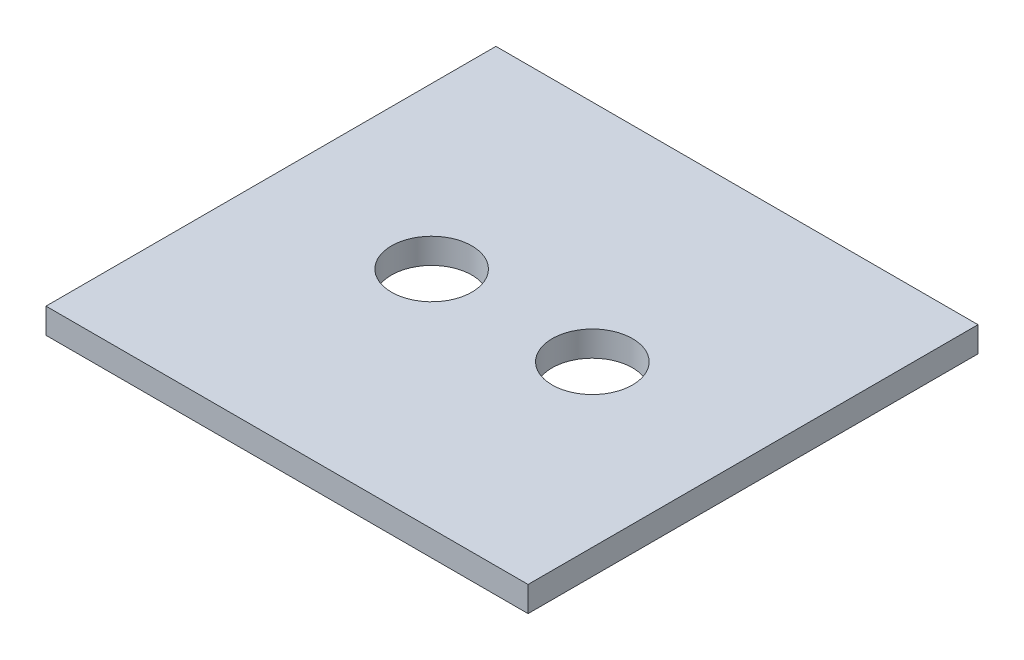
ISO-10303-21;
HEADER;
FILE_DESCRIPTION(('STEP AP214'),'2;1');
FILE_NAME('part.step','',(''),(''),'','','');
FILE_SCHEMA(('AUTOMOTIVE_DESIGN { 1 0 10303 214 1 1 1 1 }'));
ENDSEC;
DATA;
#1=APPLICATION_CONTEXT('core data for automotive mechanical design processes');
#2=APPLICATION_PROTOCOL_DEFINITION('international standard','automotive_design',2000,#1);
#3=PRODUCT_CONTEXT('',#1,'mechanical');
#4=PRODUCT('Part','Part','',(#3));
#5=PRODUCT_RELATED_PRODUCT_CATEGORY('part','',(#4));
#6=PRODUCT_DEFINITION_FORMATION('','',#4);
#7=PRODUCT_DEFINITION_CONTEXT('part definition',#1,'design');
#8=PRODUCT_DEFINITION('design','',#6,#7);
#9=PRODUCT_DEFINITION_SHAPE('','',#8);
#10=(LENGTH_UNIT() NAMED_UNIT(*) SI_UNIT(.MILLI.,.METRE.));
#11=(NAMED_UNIT(*) PLANE_ANGLE_UNIT() SI_UNIT($,.RADIAN.));
#12=(NAMED_UNIT(*) SI_UNIT($,.STERADIAN.) SOLID_ANGLE_UNIT());
#13=UNCERTAINTY_MEASURE_WITH_UNIT(LENGTH_MEASURE(1.E-05),#10,'distance_accuracy_value','');
#14=(GEOMETRIC_REPRESENTATION_CONTEXT(3) GLOBAL_UNCERTAINTY_ASSIGNED_CONTEXT((#13)) GLOBAL_UNIT_ASSIGNED_CONTEXT((#10,
#11,#12)) REPRESENTATION_CONTEXT('',''));
#15=CARTESIAN_POINT('',(0.,0.,0.));
#16=DIRECTION('',(0.,0.,1.));
#17=DIRECTION('',(1.,0.,0.));
#18=AXIS2_PLACEMENT_3D('',#15,#16,#17);
#19=CARTESIAN_POINT('',(0.,2.,0.));
#20=DIRECTION('',(0.,-1.,0.));
#21=DIRECTION('',(0.,0.,-1.));
#22=AXIS2_PLACEMENT_3D('',#19,#20,#21);
#23=PLANE('',#22);
#24=DIRECTION('',(0.,0.,-1.));
#25=VECTOR('',#24,1.);
#26=CARTESIAN_POINT('',(19.05,2.,17.78));
#27=LINE('',#26,#25);
#28=CARTESIAN_POINT('',(19.05,2.,17.78));
#29=VERTEX_POINT('',#28);
#30=CARTESIAN_POINT('',(19.05,2.,-17.78));
#31=VERTEX_POINT('',#30);
#32=EDGE_CURVE('E85',#29,#31,#27,.T.);
#33=ORIENTED_EDGE('',*,*,#32,.T.);
#34=DIRECTION('',(-1.,0.,0.));
#35=VECTOR('',#34,1.);
#36=CARTESIAN_POINT('',(-19.05,2.,-17.78));
#37=LINE('',#36,#35);
#38=CARTESIAN_POINT('',(-19.05,2.,-17.78));
#39=VERTEX_POINT('',#38);
#40=EDGE_CURVE('E80',#31,#39,#37,.T.);
#41=ORIENTED_EDGE('',*,*,#40,.T.);
#42=DIRECTION('',(0.,0.,1.));
#43=VECTOR('',#42,1.);
#44=CARTESIAN_POINT('',(-19.05,2.,17.78));
#45=LINE('',#44,#43);
#46=CARTESIAN_POINT('',(-19.05,2.,17.78));
#47=VERTEX_POINT('',#46);
#48=EDGE_CURVE('E83',#39,#47,#45,.T.);
#49=ORIENTED_EDGE('',*,*,#48,.T.);
#50=DIRECTION('',(1.,0.,0.));
#51=VECTOR('',#50,1.);
#52=CARTESIAN_POINT('',(-19.05,2.,17.78));
#53=LINE('',#52,#51);
#54=EDGE_CURVE('E50',#47,#29,#53,.T.);
#55=ORIENTED_EDGE('',*,*,#54,.T.);
#56=EDGE_LOOP('',(#33,#41,#49,#55));
#57=FACE_BOUND('',#56,.T.);
#58=CARTESIAN_POINT('',(-6.35,2.,0.));
#59=DIRECTION('',(0.,1.,0.));
#60=DIRECTION('',(0.,0.,1.));
#61=AXIS2_PLACEMENT_3D('',#58,#59,#60);
#62=CIRCLE('',#61,3.175);
#63=CARTESIAN_POINT('',(-6.35,2.,3.175));
#64=VERTEX_POINT('',#63);
#65=EDGE_CURVE('E100',#64,#64,#62,.T.);
#66=ORIENTED_EDGE('',*,*,#65,.F.);
#67=EDGE_LOOP('',(#66));
#68=FACE_BOUND('',#67,.T.);
#69=CARTESIAN_POINT('',(6.35,2.,0.));
#70=DIRECTION('',(0.,1.,0.));
#71=DIRECTION('',(0.,0.,1.));
#72=AXIS2_PLACEMENT_3D('',#69,#70,#71);
#73=CIRCLE('',#72,3.175);
#74=CARTESIAN_POINT('',(6.35,2.,3.175));
#75=VERTEX_POINT('',#74);
#76=EDGE_CURVE('E115',#75,#75,#73,.T.);
#77=ORIENTED_EDGE('',*,*,#76,.F.);
#78=EDGE_LOOP('',(#77));
#79=FACE_BOUND('',#78,.T.);
#80=ADVANCED_FACE('F33',(#57,#68,#79),#23,.F.);
#81=CARTESIAN_POINT('',(0.,0.,0.));
#82=DIRECTION('',(0.,-1.,0.));
#83=DIRECTION('',(0.,0.,-1.));
#84=AXIS2_PLACEMENT_3D('',#81,#82,#83);
#85=PLANE('',#84);
#86=CARTESIAN_POINT('',(-6.35,0.,0.));
#87=DIRECTION('',(0.,1.,0.));
#88=DIRECTION('',(0.,0.,1.));
#89=AXIS2_PLACEMENT_3D('',#86,#87,#88);
#90=CIRCLE('',#89,3.175);
#91=CARTESIAN_POINT('',(-6.35,0.,3.175));
#92=VERTEX_POINT('',#91);
#93=EDGE_CURVE('E112',#92,#92,#90,.T.);
#94=ORIENTED_EDGE('',*,*,#93,.T.);
#95=EDGE_LOOP('',(#94));
#96=FACE_BOUND('',#95,.T.);
#97=DIRECTION('',(0.,0.,-1.));
#98=VECTOR('',#97,1.);
#99=CARTESIAN_POINT('',(19.05,0.,17.78));
#100=LINE('',#99,#98);
#101=CARTESIAN_POINT('',(19.05,0.,17.78));
#102=VERTEX_POINT('',#101);
#103=CARTESIAN_POINT('',(19.05,0.,-17.78));
#104=VERTEX_POINT('',#103);
#105=EDGE_CURVE('E97',#102,#104,#100,.T.);
#106=ORIENTED_EDGE('',*,*,#105,.F.);
#107=DIRECTION('',(1.,0.,0.));
#108=VECTOR('',#107,1.);
#109=CARTESIAN_POINT('',(-19.05,0.,17.78));
#110=LINE('',#109,#108);
#111=CARTESIAN_POINT('',(-19.05,0.,17.78));
#112=VERTEX_POINT('',#111);
#113=EDGE_CURVE('E73',#112,#102,#110,.T.);
#114=ORIENTED_EDGE('',*,*,#113,.F.);
#115=DIRECTION('',(0.,0.,1.));
#116=VECTOR('',#115,1.);
#117=CARTESIAN_POINT('',(-19.05,0.,17.78));
#118=LINE('',#117,#116);
#119=CARTESIAN_POINT('',(-19.05,0.,-17.78));
#120=VERTEX_POINT('',#119);
#121=EDGE_CURVE('E67',#120,#112,#118,.T.);
#122=ORIENTED_EDGE('',*,*,#121,.F.);
#123=DIRECTION('',(-1.,0.,0.));
#124=VECTOR('',#123,1.);
#125=CARTESIAN_POINT('',(-19.05,0.,-17.78));
#126=LINE('',#125,#124);
#127=EDGE_CURVE('E89',#104,#120,#126,.T.);
#128=ORIENTED_EDGE('',*,*,#127,.F.);
#129=EDGE_LOOP('',(#106,#114,#122,#128));
#130=FACE_BOUND('',#129,.T.);
#131=CARTESIAN_POINT('',(6.35,0.,0.));
#132=DIRECTION('',(0.,1.,0.));
#133=DIRECTION('',(0.,0.,1.));
#134=AXIS2_PLACEMENT_3D('',#131,#132,#133);
#135=CIRCLE('',#134,3.175);
#136=CARTESIAN_POINT('',(6.35,0.,3.175));
#137=VERTEX_POINT('',#136);
#138=EDGE_CURVE('E118',#137,#137,#135,.T.);
#139=ORIENTED_EDGE('',*,*,#138,.T.);
#140=EDGE_LOOP('',(#139));
#141=FACE_BOUND('',#140,.T.);
#142=ADVANCED_FACE('F108',(#96,#130,#141),#85,.T.);
#143=CARTESIAN_POINT('',(19.05,2.,17.78));
#144=DIRECTION('',(-1.,0.,0.));
#145=DIRECTION('',(0.,0.,1.));
#146=AXIS2_PLACEMENT_3D('',#143,#144,#145);
#147=PLANE('',#146);
#148=ORIENTED_EDGE('',*,*,#105,.T.);
#149=DIRECTION('',(0.,-1.,0.));
#150=VECTOR('',#149,1.);
#151=CARTESIAN_POINT('',(19.05,2.,-17.78));
#152=LINE('',#151,#150);
#153=EDGE_CURVE('E11',#31,#104,#152,.T.);
#154=ORIENTED_EDGE('',*,*,#153,.F.);
#155=ORIENTED_EDGE('',*,*,#32,.F.);
#156=DIRECTION('',(0.,-1.,0.));
#157=VECTOR('',#156,1.);
#158=CARTESIAN_POINT('',(19.05,2.,17.78));
#159=LINE('',#158,#157);
#160=EDGE_CURVE('E93',#29,#102,#159,.T.);
#161=ORIENTED_EDGE('',*,*,#160,.T.);
#162=EDGE_LOOP('',(#148,#154,#155,#161));
#163=FACE_BOUND('',#162,.T.);
#164=ADVANCED_FACE('F35',(#163),#147,.F.);
#165=CARTESIAN_POINT('',(-19.05,2.,-17.78));
#166=DIRECTION('',(0.,0.,1.));
#167=DIRECTION('',(1.,0.,0.));
#168=AXIS2_PLACEMENT_3D('',#165,#166,#167);
#169=PLANE('',#168);
#170=ORIENTED_EDGE('',*,*,#127,.T.);
#171=DIRECTION('',(0.,-1.,0.));
#172=VECTOR('',#171,1.);
#173=CARTESIAN_POINT('',(-19.05,2.,-17.78));
#174=LINE('',#173,#172);
#175=EDGE_CURVE('E42',#39,#120,#174,.T.);
#176=ORIENTED_EDGE('',*,*,#175,.F.);
#177=ORIENTED_EDGE('',*,*,#40,.F.);
#178=ORIENTED_EDGE('',*,*,#153,.T.);
#179=EDGE_LOOP('',(#170,#176,#177,#178));
#180=FACE_BOUND('',#179,.T.);
#181=ADVANCED_FACE('F88',(#180),#169,.F.);
#182=CARTESIAN_POINT('',(-19.05,2.,17.78));
#183=DIRECTION('',(1.,0.,0.));
#184=DIRECTION('',(0.,0.,-1.));
#185=AXIS2_PLACEMENT_3D('',#182,#183,#184);
#186=PLANE('',#185);
#187=ORIENTED_EDGE('',*,*,#121,.T.);
#188=DIRECTION('',(0.,-1.,0.));
#189=VECTOR('',#188,1.);
#190=CARTESIAN_POINT('',(-19.05,2.,17.78));
#191=LINE('',#190,#189);
#192=EDGE_CURVE('E90',#47,#112,#191,.T.);
#193=ORIENTED_EDGE('',*,*,#192,.F.);
#194=ORIENTED_EDGE('',*,*,#48,.F.);
#195=ORIENTED_EDGE('',*,*,#175,.T.);
#196=EDGE_LOOP('',(#187,#193,#194,#195));
#197=FACE_BOUND('',#196,.T.);
#198=ADVANCED_FACE('F91',(#197),#186,.F.);
#199=CARTESIAN_POINT('',(-19.05,2.,17.78));
#200=DIRECTION('',(0.,0.,-1.));
#201=DIRECTION('',(-1.,0.,0.));
#202=AXIS2_PLACEMENT_3D('',#199,#200,#201);
#203=PLANE('',#202);
#204=ORIENTED_EDGE('',*,*,#113,.T.);
#205=ORIENTED_EDGE('',*,*,#160,.F.);
#206=ORIENTED_EDGE('',*,*,#54,.F.);
#207=ORIENTED_EDGE('',*,*,#192,.T.);
#208=EDGE_LOOP('',(#204,#205,#206,#207));
#209=FACE_BOUND('',#208,.T.);
#210=ADVANCED_FACE('F105',(#209),#203,.F.);
#211=CARTESIAN_POINT('',(-6.35,2.,0.));
#212=DIRECTION('',(0.,-1.,0.));
#213=DIRECTION('',(0.,0.,-1.));
#214=AXIS2_PLACEMENT_3D('',#211,#212,#213);
#215=CYLINDRICAL_SURFACE('',#214,3.175);
#216=ORIENTED_EDGE('',*,*,#65,.T.);
#217=EDGE_LOOP('',(#216));
#218=FACE_BOUND('',#217,.T.);
#219=ORIENTED_EDGE('',*,*,#93,.F.);
#220=EDGE_LOOP('',(#219));
#221=FACE_BOUND('',#220,.T.);
#222=ADVANCED_FACE('F135',(#218,#221),#215,.F.);
#223=CARTESIAN_POINT('',(6.35,2.,0.));
#224=DIRECTION('',(0.,-1.,0.));
#225=DIRECTION('',(0.,0.,-1.));
#226=AXIS2_PLACEMENT_3D('',#223,#224,#225);
#227=CYLINDRICAL_SURFACE('',#226,3.175);
#228=ORIENTED_EDGE('',*,*,#76,.T.);
#229=EDGE_LOOP('',(#228));
#230=FACE_BOUND('',#229,.T.);
#231=ORIENTED_EDGE('',*,*,#138,.F.);
#232=EDGE_LOOP('',(#231));
#233=FACE_BOUND('',#232,.T.);
#234=ADVANCED_FACE('F124',(#230,#233),#227,.F.);
#235=CLOSED_SHELL('',(#80,#142,#164,#181,#198,#210,#222,#234));
#236=MANIFOLD_SOLID_BREP('B2',#235);
#237=ADVANCED_BREP_SHAPE_REPRESENTATION('',(#18,#236),#14);
#238=SHAPE_DEFINITION_REPRESENTATION(#9,#237);
ENDSEC;
END-ISO-10303-21;
